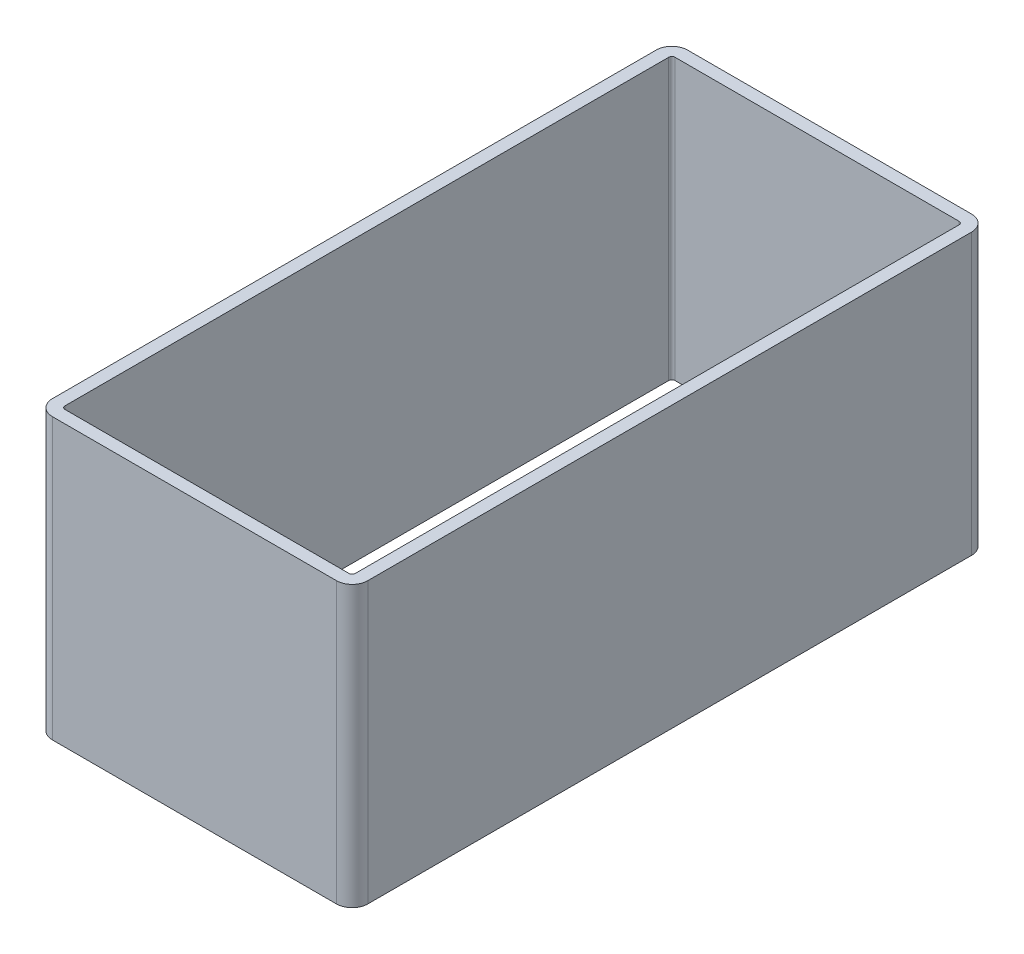
ISO-10303-21;
HEADER;
FILE_DESCRIPTION(('STEP AP214'),'2;1');
FILE_NAME('part.step','',(''),(''),'','','');
FILE_SCHEMA(('AUTOMOTIVE_DESIGN { 1 0 10303 214 1 1 1 1 }'));
ENDSEC;
DATA;
#1=APPLICATION_CONTEXT('core data for automotive mechanical design processes');
#2=APPLICATION_PROTOCOL_DEFINITION('international standard','automotive_design',2000,#1);
#3=PRODUCT_CONTEXT('',#1,'mechanical');
#4=PRODUCT('Part','Part','',(#3));
#5=PRODUCT_RELATED_PRODUCT_CATEGORY('part','',(#4));
#6=PRODUCT_DEFINITION_FORMATION('','',#4);
#7=PRODUCT_DEFINITION_CONTEXT('part definition',#1,'design');
#8=PRODUCT_DEFINITION('design','',#6,#7);
#9=PRODUCT_DEFINITION_SHAPE('','',#8);
#10=(LENGTH_UNIT() NAMED_UNIT(*) SI_UNIT(.MILLI.,.METRE.));
#11=(NAMED_UNIT(*) PLANE_ANGLE_UNIT() SI_UNIT($,.RADIAN.));
#12=(NAMED_UNIT(*) SI_UNIT($,.STERADIAN.) SOLID_ANGLE_UNIT());
#13=UNCERTAINTY_MEASURE_WITH_UNIT(LENGTH_MEASURE(1.E-05),#10,'distance_accuracy_value','');
#14=(GEOMETRIC_REPRESENTATION_CONTEXT(3) GLOBAL_UNCERTAINTY_ASSIGNED_CONTEXT((#13)) GLOBAL_UNIT_ASSIGNED_CONTEXT((#10,
#11,#12)) REPRESENTATION_CONTEXT('',''));
#15=CARTESIAN_POINT('',(0.,0.,0.));
#16=DIRECTION('',(0.,0.,1.));
#17=DIRECTION('',(1.,0.,0.));
#18=AXIS2_PLACEMENT_3D('',#15,#16,#17);
#19=CARTESIAN_POINT('',(10.08,8.95,-20.3));
#20=DIRECTION('',(-1.,0.,0.));
#21=DIRECTION('',(0.,0.,1.));
#22=AXIS2_PLACEMENT_3D('',#19,#20,#21);
#23=PLANE('',#22);
#24=DIRECTION('',(0.,0.,-1.));
#25=VECTOR('',#24,1.);
#26=CARTESIAN_POINT('',(10.08,-8.95,-20.3));
#27=LINE('',#26,#25);
#28=CARTESIAN_POINT('',(10.08,-8.95,19.3));
#29=VERTEX_POINT('',#28);
#30=CARTESIAN_POINT('',(10.08,-8.95,-19.3));
#31=VERTEX_POINT('',#30);
#32=EDGE_CURVE('E205',#29,#31,#27,.T.);
#33=ORIENTED_EDGE('',*,*,#32,.T.);
#34=DIRECTION('',(0.,-1.,0.));
#35=VECTOR('',#34,1.);
#36=CARTESIAN_POINT('',(10.08,8.95,-19.3));
#37=LINE('',#36,#35);
#38=CARTESIAN_POINT('',(10.08,8.95,-19.3));
#39=VERTEX_POINT('',#38);
#40=EDGE_CURVE('E269',#31,#39,#37,.F.);
#41=ORIENTED_EDGE('',*,*,#40,.T.);
#42=DIRECTION('',(0.,0.,-1.));
#43=VECTOR('',#42,1.);
#44=CARTESIAN_POINT('',(10.08,8.95,-20.3));
#45=LINE('',#44,#43);
#46=CARTESIAN_POINT('',(10.08,8.95,19.3));
#47=VERTEX_POINT('',#46);
#48=EDGE_CURVE('E217',#47,#39,#45,.T.);
#49=ORIENTED_EDGE('',*,*,#48,.F.);
#50=DIRECTION('',(0.,-1.,0.));
#51=VECTOR('',#50,1.);
#52=CARTESIAN_POINT('',(10.08,8.95,19.3));
#53=LINE('',#52,#51);
#54=EDGE_CURVE('E266',#47,#29,#53,.T.);
#55=ORIENTED_EDGE('',*,*,#54,.T.);
#56=EDGE_LOOP('',(#33,#41,#49,#55));
#57=FACE_BOUND('',#56,.T.);
#58=ADVANCED_FACE('F36',(#57),#23,.F.);
#59=CARTESIAN_POINT('',(-10.08,8.95,-20.3));
#60=DIRECTION('',(0.,0.,1.));
#61=DIRECTION('',(1.,0.,0.));
#62=AXIS2_PLACEMENT_3D('',#59,#60,#61);
#63=PLANE('',#62);
#64=DIRECTION('',(-1.,0.,0.));
#65=VECTOR('',#64,1.);
#66=CARTESIAN_POINT('',(-10.08,-8.95,-20.3));
#67=LINE('',#66,#65);
#68=CARTESIAN_POINT('',(9.08,-8.95,-20.3));
#69=VERTEX_POINT('',#68);
#70=CARTESIAN_POINT('',(-9.08,-8.95,-20.3));
#71=VERTEX_POINT('',#70);
#72=EDGE_CURVE('E233',#69,#71,#67,.T.);
#73=ORIENTED_EDGE('',*,*,#72,.T.);
#74=DIRECTION('',(0.,-1.,0.));
#75=VECTOR('',#74,1.);
#76=CARTESIAN_POINT('',(-9.08,8.95,-20.3));
#77=LINE('',#76,#75);
#78=CARTESIAN_POINT('',(-9.08,8.95,-20.3));
#79=VERTEX_POINT('',#78);
#80=EDGE_CURVE('E256',#71,#79,#77,.F.);
#81=ORIENTED_EDGE('',*,*,#80,.T.);
#82=DIRECTION('',(-1.,0.,0.));
#83=VECTOR('',#82,1.);
#84=CARTESIAN_POINT('',(-10.08,8.95,-20.3));
#85=LINE('',#84,#83);
#86=CARTESIAN_POINT('',(9.08,8.95,-20.3));
#87=VERTEX_POINT('',#86);
#88=EDGE_CURVE('E220',#87,#79,#85,.T.);
#89=ORIENTED_EDGE('',*,*,#88,.F.);
#90=DIRECTION('',(0.,-1.,0.));
#91=VECTOR('',#90,1.);
#92=CARTESIAN_POINT('',(9.08,8.95,-20.3));
#93=LINE('',#92,#91);
#94=EDGE_CURVE('E253',#87,#69,#93,.T.);
#95=ORIENTED_EDGE('',*,*,#94,.T.);
#96=EDGE_LOOP('',(#73,#81,#89,#95));
#97=FACE_BOUND('',#96,.T.);
#98=ADVANCED_FACE('F297',(#97),#63,.F.);
#99=CARTESIAN_POINT('',(-10.08,8.95,-20.3));
#100=DIRECTION('',(1.,0.,0.));
#101=DIRECTION('',(0.,0.,-1.));
#102=AXIS2_PLACEMENT_3D('',#99,#100,#101);
#103=PLANE('',#102);
#104=DIRECTION('',(0.,0.,1.));
#105=VECTOR('',#104,1.);
#106=CARTESIAN_POINT('',(-10.08,8.95,-20.3));
#107=LINE('',#106,#105);
#108=CARTESIAN_POINT('',(-10.08,8.95,-19.3));
#109=VERTEX_POINT('',#108);
#110=CARTESIAN_POINT('',(-10.08,8.95,19.3));
#111=VERTEX_POINT('',#110);
#112=EDGE_CURVE('E224',#109,#111,#107,.T.);
#113=ORIENTED_EDGE('',*,*,#112,.F.);
#114=DIRECTION('',(0.,-1.,0.));
#115=VECTOR('',#114,1.);
#116=CARTESIAN_POINT('',(-10.08,8.95,-19.3));
#117=LINE('',#116,#115);
#118=CARTESIAN_POINT('',(-10.08,-8.95,-19.3));
#119=VERTEX_POINT('',#118);
#120=EDGE_CURVE('E242',#109,#119,#117,.T.);
#121=ORIENTED_EDGE('',*,*,#120,.T.);
#122=DIRECTION('',(0.,0.,1.));
#123=VECTOR('',#122,1.);
#124=CARTESIAN_POINT('',(-10.08,-8.95,-20.3));
#125=LINE('',#124,#123);
#126=CARTESIAN_POINT('',(-10.08,-8.95,19.3));
#127=VERTEX_POINT('',#126);
#128=EDGE_CURVE('E236',#119,#127,#125,.T.);
#129=ORIENTED_EDGE('',*,*,#128,.T.);
#130=DIRECTION('',(0.,-1.,0.));
#131=VECTOR('',#130,1.);
#132=CARTESIAN_POINT('',(-10.08,8.95,19.3));
#133=LINE('',#132,#131);
#134=EDGE_CURVE('E230',#127,#111,#133,.F.);
#135=ORIENTED_EDGE('',*,*,#134,.T.);
#136=EDGE_LOOP('',(#113,#121,#129,#135));
#137=FACE_BOUND('',#136,.T.);
#138=ADVANCED_FACE('F305',(#137),#103,.F.);
#139=CARTESIAN_POINT('',(-10.08,8.95,20.3));
#140=DIRECTION('',(0.,0.,-1.));
#141=DIRECTION('',(-1.,0.,0.));
#142=AXIS2_PLACEMENT_3D('',#139,#140,#141);
#143=PLANE('',#142);
#144=DIRECTION('',(1.,0.,0.));
#145=VECTOR('',#144,1.);
#146=CARTESIAN_POINT('',(-10.08,-8.95,20.3));
#147=LINE('',#146,#145);
#148=CARTESIAN_POINT('',(-9.08,-8.95,20.3));
#149=VERTEX_POINT('',#148);
#150=CARTESIAN_POINT('',(9.08,-8.95,20.3));
#151=VERTEX_POINT('',#150);
#152=EDGE_CURVE('E221',#149,#151,#147,.T.);
#153=ORIENTED_EDGE('',*,*,#152,.T.);
#154=DIRECTION('',(0.,-1.,0.));
#155=VECTOR('',#154,1.);
#156=CARTESIAN_POINT('',(9.08,8.95,20.3));
#157=LINE('',#156,#155);
#158=CARTESIAN_POINT('',(9.08,8.95,20.3));
#159=VERTEX_POINT('',#158);
#160=EDGE_CURVE('E11',#151,#159,#157,.F.);
#161=ORIENTED_EDGE('',*,*,#160,.T.);
#162=DIRECTION('',(1.,0.,0.));
#163=VECTOR('',#162,1.);
#164=CARTESIAN_POINT('',(-10.08,8.95,20.3));
#165=LINE('',#164,#163);
#166=CARTESIAN_POINT('',(-9.08,8.95,20.3));
#167=VERTEX_POINT('',#166);
#168=EDGE_CURVE('E227',#167,#159,#165,.T.);
#169=ORIENTED_EDGE('',*,*,#168,.F.);
#170=DIRECTION('',(0.,-1.,0.));
#171=VECTOR('',#170,1.);
#172=CARTESIAN_POINT('',(-9.08,8.95,20.3));
#173=LINE('',#172,#171);
#174=EDGE_CURVE('E44',#167,#149,#173,.T.);
#175=ORIENTED_EDGE('',*,*,#174,.T.);
#176=EDGE_LOOP('',(#153,#161,#169,#175));
#177=FACE_BOUND('',#176,.T.);
#178=ADVANCED_FACE('F275',(#177),#143,.F.);
#179=CARTESIAN_POINT('',(0.,8.95,0.));
#180=DIRECTION('',(0.,1.,0.));
#181=DIRECTION('',(0.,0.,1.));
#182=AXIS2_PLACEMENT_3D('',#179,#180,#181);
#183=PLANE('',#182);
#184=CARTESIAN_POINT('',(9.08,8.95,-19.3));
#185=DIRECTION('',(0.,1.,0.));
#186=DIRECTION('',(0.,0.,1.));
#187=AXIS2_PLACEMENT_3D('',#184,#185,#186);
#188=CIRCLE('',#187,0.200000000000003);
#189=CARTESIAN_POINT('',(9.28,8.95,-19.3));
#190=VERTEX_POINT('',#189);
#191=CARTESIAN_POINT('',(9.08,8.95,-19.5));
#192=VERTEX_POINT('',#191);
#193=EDGE_CURVE('E51',#190,#192,#188,.T.);
#194=ORIENTED_EDGE('',*,*,#193,.F.);
#195=DIRECTION('',(0.,0.,-1.));
#196=VECTOR('',#195,1.);
#197=CARTESIAN_POINT('',(9.28,8.95,19.3));
#198=LINE('',#197,#196);
#199=CARTESIAN_POINT('',(9.28,8.95,19.3));
#200=VERTEX_POINT('',#199);
#201=EDGE_CURVE('E167',#200,#190,#198,.T.);
#202=ORIENTED_EDGE('',*,*,#201,.F.);
#203=CARTESIAN_POINT('',(9.08,8.95,19.3));
#204=DIRECTION('',(0.,1.,0.));
#205=DIRECTION('',(0.,0.,1.));
#206=AXIS2_PLACEMENT_3D('',#203,#204,#205);
#207=CIRCLE('',#206,0.200000000000001);
#208=CARTESIAN_POINT('',(9.08,8.95,19.5));
#209=VERTEX_POINT('',#208);
#210=EDGE_CURVE('E170',#209,#200,#207,.T.);
#211=ORIENTED_EDGE('',*,*,#210,.F.);
#212=DIRECTION('',(1.,0.,0.));
#213=VECTOR('',#212,1.);
#214=CARTESIAN_POINT('',(-9.08,8.95,19.5));
#215=LINE('',#214,#213);
#216=CARTESIAN_POINT('',(-9.08,8.95,19.5));
#217=VERTEX_POINT('',#216);
#218=EDGE_CURVE('E198',#217,#209,#215,.T.);
#219=ORIENTED_EDGE('',*,*,#218,.F.);
#220=CARTESIAN_POINT('',(-9.08,8.95,19.3));
#221=DIRECTION('',(0.,1.,0.));
#222=DIRECTION('',(0.,0.,1.));
#223=AXIS2_PLACEMENT_3D('',#220,#221,#222);
#224=CIRCLE('',#223,0.200000000000001);
#225=CARTESIAN_POINT('',(-9.28,8.95,19.3));
#226=VERTEX_POINT('',#225);
#227=EDGE_CURVE('E195',#226,#217,#224,.T.);
#228=ORIENTED_EDGE('',*,*,#227,.F.);
#229=DIRECTION('',(0.,0.,1.));
#230=VECTOR('',#229,1.);
#231=CARTESIAN_POINT('',(-9.28,8.95,-19.3));
#232=LINE('',#231,#230);
#233=CARTESIAN_POINT('',(-9.28,8.95,-19.3));
#234=VERTEX_POINT('',#233);
#235=EDGE_CURVE('E192',#234,#226,#232,.T.);
#236=ORIENTED_EDGE('',*,*,#235,.F.);
#237=CARTESIAN_POINT('',(-9.08,8.95,-19.3));
#238=DIRECTION('',(0.,1.,0.));
#239=DIRECTION('',(0.,0.,1.));
#240=AXIS2_PLACEMENT_3D('',#237,#238,#239);
#241=CIRCLE('',#240,0.2);
#242=CARTESIAN_POINT('',(-9.08,8.95,-19.5));
#243=VERTEX_POINT('',#242);
#244=EDGE_CURVE('E189',#243,#234,#241,.T.);
#245=ORIENTED_EDGE('',*,*,#244,.F.);
#246=DIRECTION('',(-1.,0.,0.));
#247=VECTOR('',#246,1.);
#248=CARTESIAN_POINT('',(9.08,8.95,-19.5));
#249=LINE('',#248,#247);
#250=EDGE_CURVE('E187',#192,#243,#249,.T.);
#251=ORIENTED_EDGE('',*,*,#250,.F.);
#252=EDGE_LOOP('',(#194,#202,#211,#219,#228,#236,#245,#251));
#253=FACE_BOUND('',#252,.T.);
#254=ORIENTED_EDGE('',*,*,#88,.T.);
#255=CARTESIAN_POINT('',(-9.08,8.95,-19.3));
#256=DIRECTION('',(0.,1.,0.));
#257=DIRECTION('',(0.,0.,1.));
#258=AXIS2_PLACEMENT_3D('',#255,#256,#257);
#259=CIRCLE('',#258,1.);
#260=EDGE_CURVE('E264',#79,#109,#259,.T.);
#261=ORIENTED_EDGE('',*,*,#260,.T.);
#262=ORIENTED_EDGE('',*,*,#112,.T.);
#263=CARTESIAN_POINT('',(-9.08,8.95,19.3));
#264=DIRECTION('',(0.,1.,0.));
#265=DIRECTION('',(0.,0.,1.));
#266=AXIS2_PLACEMENT_3D('',#263,#264,#265);
#267=CIRCLE('',#266,1.);
#268=EDGE_CURVE('E258',#111,#167,#267,.T.);
#269=ORIENTED_EDGE('',*,*,#268,.T.);
#270=ORIENTED_EDGE('',*,*,#168,.T.);
#271=CARTESIAN_POINT('',(9.08,8.95,19.3));
#272=DIRECTION('',(0.,1.,0.));
#273=DIRECTION('',(0.,0.,1.));
#274=AXIS2_PLACEMENT_3D('',#271,#272,#273);
#275=CIRCLE('',#274,1.);
#276=EDGE_CURVE('E260',#159,#47,#275,.T.);
#277=ORIENTED_EDGE('',*,*,#276,.T.);
#278=ORIENTED_EDGE('',*,*,#48,.T.);
#279=CARTESIAN_POINT('',(9.08,8.95,-19.3));
#280=DIRECTION('',(0.,1.,0.));
#281=DIRECTION('',(0.,0.,1.));
#282=AXIS2_PLACEMENT_3D('',#279,#280,#281);
#283=CIRCLE('',#282,1.);
#284=EDGE_CURVE('E262',#39,#87,#283,.T.);
#285=ORIENTED_EDGE('',*,*,#284,.T.);
#286=EDGE_LOOP('',(#254,#261,#262,#269,#270,#277,#278,#285));
#287=FACE_BOUND('',#286,.T.);
#288=ADVANCED_FACE('F290',(#253,#287),#183,.T.);
#289=CARTESIAN_POINT('',(0.,-8.95,0.));
#290=DIRECTION('',(0.,1.,0.));
#291=DIRECTION('',(0.,0.,1.));
#292=AXIS2_PLACEMENT_3D('',#289,#290,#291);
#293=PLANE('',#292);
#294=DIRECTION('',(0.,0.,-1.));
#295=VECTOR('',#294,1.);
#296=CARTESIAN_POINT('',(9.28,-8.95,19.3));
#297=LINE('',#296,#295);
#298=CARTESIAN_POINT('',(9.28,-8.95,19.3));
#299=VERTEX_POINT('',#298);
#300=CARTESIAN_POINT('',(9.28,-8.95,-19.3));
#301=VERTEX_POINT('',#300);
#302=EDGE_CURVE('E156',#299,#301,#297,.T.);
#303=ORIENTED_EDGE('',*,*,#302,.T.);
#304=CARTESIAN_POINT('',(9.08,-8.95,-19.3));
#305=DIRECTION('',(0.,1.,0.));
#306=DIRECTION('',(0.,0.,1.));
#307=AXIS2_PLACEMENT_3D('',#304,#305,#306);
#308=CIRCLE('',#307,0.200000000000003);
#309=CARTESIAN_POINT('',(9.08,-8.95,-19.5));
#310=VERTEX_POINT('',#309);
#311=EDGE_CURVE('E150',#301,#310,#308,.T.);
#312=ORIENTED_EDGE('',*,*,#311,.T.);
#313=DIRECTION('',(-1.,0.,0.));
#314=VECTOR('',#313,1.);
#315=CARTESIAN_POINT('',(9.08,-8.95,-19.5));
#316=LINE('',#315,#314);
#317=CARTESIAN_POINT('',(-9.08,-8.95,-19.5));
#318=VERTEX_POINT('',#317);
#319=EDGE_CURVE('E159',#310,#318,#316,.T.);
#320=ORIENTED_EDGE('',*,*,#319,.T.);
#321=CARTESIAN_POINT('',(-9.08,-8.95,-19.3));
#322=DIRECTION('',(0.,1.,0.));
#323=DIRECTION('',(0.,0.,1.));
#324=AXIS2_PLACEMENT_3D('',#321,#322,#323);
#325=CIRCLE('',#324,0.2);
#326=CARTESIAN_POINT('',(-9.28,-8.95,-19.3));
#327=VERTEX_POINT('',#326);
#328=EDGE_CURVE('E59',#318,#327,#325,.T.);
#329=ORIENTED_EDGE('',*,*,#328,.T.);
#330=DIRECTION('',(0.,0.,1.));
#331=VECTOR('',#330,1.);
#332=CARTESIAN_POINT('',(-9.28,-8.95,-19.3));
#333=LINE('',#332,#331);
#334=CARTESIAN_POINT('',(-9.28,-8.95,19.3));
#335=VERTEX_POINT('',#334);
#336=EDGE_CURVE('E174',#327,#335,#333,.T.);
#337=ORIENTED_EDGE('',*,*,#336,.T.);
#338=CARTESIAN_POINT('',(-9.08,-8.95,19.3));
#339=DIRECTION('',(0.,1.,0.));
#340=DIRECTION('',(0.,0.,1.));
#341=AXIS2_PLACEMENT_3D('',#338,#339,#340);
#342=CIRCLE('',#341,0.200000000000001);
#343=CARTESIAN_POINT('',(-9.08,-8.95,19.5));
#344=VERTEX_POINT('',#343);
#345=EDGE_CURVE('E177',#335,#344,#342,.T.);
#346=ORIENTED_EDGE('',*,*,#345,.T.);
#347=DIRECTION('',(1.,0.,0.));
#348=VECTOR('',#347,1.);
#349=CARTESIAN_POINT('',(-9.08,-8.95,19.5));
#350=LINE('',#349,#348);
#351=CARTESIAN_POINT('',(9.08,-8.95,19.5));
#352=VERTEX_POINT('',#351);
#353=EDGE_CURVE('E180',#344,#352,#350,.T.);
#354=ORIENTED_EDGE('',*,*,#353,.T.);
#355=CARTESIAN_POINT('',(9.08,-8.95,19.3));
#356=DIRECTION('',(0.,1.,0.));
#357=DIRECTION('',(0.,0.,1.));
#358=AXIS2_PLACEMENT_3D('',#355,#356,#357);
#359=CIRCLE('',#358,0.200000000000001);
#360=EDGE_CURVE('E183',#352,#299,#359,.T.);
#361=ORIENTED_EDGE('',*,*,#360,.T.);
#362=EDGE_LOOP('',(#303,#312,#320,#329,#337,#346,#354,#361));
#363=FACE_BOUND('',#362,.T.);
#364=ORIENTED_EDGE('',*,*,#128,.F.);
#365=CARTESIAN_POINT('',(-9.08,-8.95,-19.3));
#366=DIRECTION('',(0.,1.,0.));
#367=DIRECTION('',(0.,0.,1.));
#368=AXIS2_PLACEMENT_3D('',#365,#366,#367);
#369=CIRCLE('',#368,1.);
#370=EDGE_CURVE('E251',#119,#71,#369,.F.);
#371=ORIENTED_EDGE('',*,*,#370,.T.);
#372=ORIENTED_EDGE('',*,*,#72,.F.);
#373=CARTESIAN_POINT('',(9.08,-8.95,-19.3));
#374=DIRECTION('',(0.,1.,0.));
#375=DIRECTION('',(0.,0.,1.));
#376=AXIS2_PLACEMENT_3D('',#373,#374,#375);
#377=CIRCLE('',#376,1.);
#378=EDGE_CURVE('E249',#69,#31,#377,.F.);
#379=ORIENTED_EDGE('',*,*,#378,.T.);
#380=ORIENTED_EDGE('',*,*,#32,.F.);
#381=CARTESIAN_POINT('',(9.08,-8.95,19.3));
#382=DIRECTION('',(0.,1.,0.));
#383=DIRECTION('',(0.,0.,1.));
#384=AXIS2_PLACEMENT_3D('',#381,#382,#383);
#385=CIRCLE('',#384,1.);
#386=EDGE_CURVE('E247',#29,#151,#385,.F.);
#387=ORIENTED_EDGE('',*,*,#386,.T.);
#388=ORIENTED_EDGE('',*,*,#152,.F.);
#389=CARTESIAN_POINT('',(-9.08,-8.95,19.3));
#390=DIRECTION('',(0.,1.,0.));
#391=DIRECTION('',(0.,0.,1.));
#392=AXIS2_PLACEMENT_3D('',#389,#390,#391);
#393=CIRCLE('',#392,1.);
#394=EDGE_CURVE('E245',#149,#127,#393,.F.);
#395=ORIENTED_EDGE('',*,*,#394,.T.);
#396=EDGE_LOOP('',(#364,#371,#372,#379,#380,#387,#388,#395));
#397=FACE_BOUND('',#396,.T.);
#398=ADVANCED_FACE('F163',(#363,#397),#293,.F.);
#399=CARTESIAN_POINT('',(-9.08,8.95,-19.3));
#400=DIRECTION('',(0.,-1.,0.));
#401=DIRECTION('',(0.,0.,-1.));
#402=AXIS2_PLACEMENT_3D('',#399,#400,#401);
#403=CYLINDRICAL_SURFACE('',#402,1.);
#404=ORIENTED_EDGE('',*,*,#260,.F.);
#405=ORIENTED_EDGE('',*,*,#80,.F.);
#406=ORIENTED_EDGE('',*,*,#370,.F.);
#407=ORIENTED_EDGE('',*,*,#120,.F.);
#408=EDGE_LOOP('',(#404,#405,#406,#407));
#409=FACE_BOUND('',#408,.T.);
#410=ADVANCED_FACE('F302',(#409),#403,.T.);
#411=CARTESIAN_POINT('',(9.08,8.95,-19.3));
#412=DIRECTION('',(0.,-1.,0.));
#413=DIRECTION('',(0.,0.,-1.));
#414=AXIS2_PLACEMENT_3D('',#411,#412,#413);
#415=CYLINDRICAL_SURFACE('',#414,1.);
#416=ORIENTED_EDGE('',*,*,#284,.F.);
#417=ORIENTED_EDGE('',*,*,#40,.F.);
#418=ORIENTED_EDGE('',*,*,#378,.F.);
#419=ORIENTED_EDGE('',*,*,#94,.F.);
#420=EDGE_LOOP('',(#416,#417,#418,#419));
#421=FACE_BOUND('',#420,.T.);
#422=ADVANCED_FACE('F294',(#421),#415,.T.);
#423=CARTESIAN_POINT('',(9.08,8.95,19.3));
#424=DIRECTION('',(0.,-1.,0.));
#425=DIRECTION('',(0.,0.,-1.));
#426=AXIS2_PLACEMENT_3D('',#423,#424,#425);
#427=CYLINDRICAL_SURFACE('',#426,1.);
#428=ORIENTED_EDGE('',*,*,#276,.F.);
#429=ORIENTED_EDGE('',*,*,#160,.F.);
#430=ORIENTED_EDGE('',*,*,#386,.F.);
#431=ORIENTED_EDGE('',*,*,#54,.F.);
#432=EDGE_LOOP('',(#428,#429,#430,#431));
#433=FACE_BOUND('',#432,.T.);
#434=ADVANCED_FACE('F284',(#433),#427,.T.);
#435=CARTESIAN_POINT('',(-9.08,8.95,19.3));
#436=DIRECTION('',(0.,-1.,0.));
#437=DIRECTION('',(0.,0.,-1.));
#438=AXIS2_PLACEMENT_3D('',#435,#436,#437);
#439=CYLINDRICAL_SURFACE('',#438,1.);
#440=ORIENTED_EDGE('',*,*,#268,.F.);
#441=ORIENTED_EDGE('',*,*,#134,.F.);
#442=ORIENTED_EDGE('',*,*,#394,.F.);
#443=ORIENTED_EDGE('',*,*,#174,.F.);
#444=EDGE_LOOP('',(#440,#441,#442,#443));
#445=FACE_BOUND('',#444,.T.);
#446=ADVANCED_FACE('F38',(#445),#439,.T.);
#447=CARTESIAN_POINT('',(9.08,-8.95,-19.3));
#448=DIRECTION('',(0.,1.,0.));
#449=DIRECTION('',(0.,0.,1.));
#450=AXIS2_PLACEMENT_3D('',#447,#448,#449);
#451=CYLINDRICAL_SURFACE('',#450,0.200000000000003);
#452=ORIENTED_EDGE('',*,*,#193,.T.);
#453=DIRECTION('',(0.,1.,0.));
#454=VECTOR('',#453,1.);
#455=CARTESIAN_POINT('',(9.08,-8.95,-19.5));
#456=LINE('',#455,#454);
#457=EDGE_CURVE('E146',#310,#192,#456,.T.);
#458=ORIENTED_EDGE('',*,*,#457,.F.);
#459=ORIENTED_EDGE('',*,*,#311,.F.);
#460=DIRECTION('',(0.,1.,0.));
#461=VECTOR('',#460,1.);
#462=CARTESIAN_POINT('',(9.28,-8.95,-19.3));
#463=LINE('',#462,#461);
#464=EDGE_CURVE('E203',#301,#190,#463,.T.);
#465=ORIENTED_EDGE('',*,*,#464,.T.);
#466=EDGE_LOOP('',(#452,#458,#459,#465));
#467=FACE_BOUND('',#466,.T.);
#468=ADVANCED_FACE('F148',(#467),#451,.F.);
#469=CARTESIAN_POINT('',(9.28,-8.95,19.3));
#470=DIRECTION('',(1.,0.,0.));
#471=DIRECTION('',(0.,0.,-1.));
#472=AXIS2_PLACEMENT_3D('',#469,#470,#471);
#473=PLANE('',#472);
#474=ORIENTED_EDGE('',*,*,#201,.T.);
#475=ORIENTED_EDGE('',*,*,#464,.F.);
#476=ORIENTED_EDGE('',*,*,#302,.F.);
#477=DIRECTION('',(0.,1.,0.));
#478=VECTOR('',#477,1.);
#479=CARTESIAN_POINT('',(9.28,-8.95,19.3));
#480=LINE('',#479,#478);
#481=EDGE_CURVE('E206',#299,#200,#480,.T.);
#482=ORIENTED_EDGE('',*,*,#481,.T.);
#483=EDGE_LOOP('',(#474,#475,#476,#482));
#484=FACE_BOUND('',#483,.T.);
#485=ADVANCED_FACE('F312',(#484),#473,.F.);
#486=CARTESIAN_POINT('',(9.08,-8.95,19.3));
#487=DIRECTION('',(0.,1.,0.));
#488=DIRECTION('',(0.,0.,1.));
#489=AXIS2_PLACEMENT_3D('',#486,#487,#488);
#490=CYLINDRICAL_SURFACE('',#489,0.200000000000001);
#491=ORIENTED_EDGE('',*,*,#210,.T.);
#492=ORIENTED_EDGE('',*,*,#481,.F.);
#493=ORIENTED_EDGE('',*,*,#360,.F.);
#494=DIRECTION('',(0.,1.,0.));
#495=VECTOR('',#494,1.);
#496=CARTESIAN_POINT('',(9.08,-8.95,19.5));
#497=LINE('',#496,#495);
#498=EDGE_CURVE('E208',#352,#209,#497,.T.);
#499=ORIENTED_EDGE('',*,*,#498,.T.);
#500=EDGE_LOOP('',(#491,#492,#493,#499));
#501=FACE_BOUND('',#500,.T.);
#502=ADVANCED_FACE('F372',(#501),#490,.F.);
#503=CARTESIAN_POINT('',(-9.08,-8.95,19.5));
#504=DIRECTION('',(0.,0.,1.));
#505=DIRECTION('',(1.,0.,0.));
#506=AXIS2_PLACEMENT_3D('',#503,#504,#505);
#507=PLANE('',#506);
#508=ORIENTED_EDGE('',*,*,#218,.T.);
#509=ORIENTED_EDGE('',*,*,#498,.F.);
#510=ORIENTED_EDGE('',*,*,#353,.F.);
#511=DIRECTION('',(0.,1.,0.));
#512=VECTOR('',#511,1.);
#513=CARTESIAN_POINT('',(-9.08,-8.95,19.5));
#514=LINE('',#513,#512);
#515=EDGE_CURVE('E210',#344,#217,#514,.T.);
#516=ORIENTED_EDGE('',*,*,#515,.T.);
#517=EDGE_LOOP('',(#508,#509,#510,#516));
#518=FACE_BOUND('',#517,.T.);
#519=ADVANCED_FACE('F382',(#518),#507,.F.);
#520=CARTESIAN_POINT('',(-9.08,-8.95,19.3));
#521=DIRECTION('',(0.,1.,0.));
#522=DIRECTION('',(0.,0.,1.));
#523=AXIS2_PLACEMENT_3D('',#520,#521,#522);
#524=CYLINDRICAL_SURFACE('',#523,0.200000000000001);
#525=ORIENTED_EDGE('',*,*,#227,.T.);
#526=ORIENTED_EDGE('',*,*,#515,.F.);
#527=ORIENTED_EDGE('',*,*,#345,.F.);
#528=DIRECTION('',(0.,1.,0.));
#529=VECTOR('',#528,1.);
#530=CARTESIAN_POINT('',(-9.28,-8.95,19.3));
#531=LINE('',#530,#529);
#532=EDGE_CURVE('E212',#335,#226,#531,.T.);
#533=ORIENTED_EDGE('',*,*,#532,.T.);
#534=EDGE_LOOP('',(#525,#526,#527,#533));
#535=FACE_BOUND('',#534,.T.);
#536=ADVANCED_FACE('F392',(#535),#524,.F.);
#537=CARTESIAN_POINT('',(-9.28,-8.95,-19.3));
#538=DIRECTION('',(-1.,0.,0.));
#539=DIRECTION('',(0.,0.,1.));
#540=AXIS2_PLACEMENT_3D('',#537,#538,#539);
#541=PLANE('',#540);
#542=ORIENTED_EDGE('',*,*,#235,.T.);
#543=ORIENTED_EDGE('',*,*,#532,.F.);
#544=ORIENTED_EDGE('',*,*,#336,.F.);
#545=DIRECTION('',(0.,1.,0.));
#546=VECTOR('',#545,1.);
#547=CARTESIAN_POINT('',(-9.28,-8.95,-19.3));
#548=LINE('',#547,#546);
#549=EDGE_CURVE('E214',#327,#234,#548,.T.);
#550=ORIENTED_EDGE('',*,*,#549,.T.);
#551=EDGE_LOOP('',(#542,#543,#544,#550));
#552=FACE_BOUND('',#551,.T.);
#553=ADVANCED_FACE('F402',(#552),#541,.F.);
#554=CARTESIAN_POINT('',(-9.08,-8.95,-19.3));
#555=DIRECTION('',(0.,1.,0.));
#556=DIRECTION('',(0.,0.,1.));
#557=AXIS2_PLACEMENT_3D('',#554,#555,#556);
#558=CYLINDRICAL_SURFACE('',#557,0.2);
#559=ORIENTED_EDGE('',*,*,#244,.T.);
#560=ORIENTED_EDGE('',*,*,#549,.F.);
#561=ORIENTED_EDGE('',*,*,#328,.F.);
#562=DIRECTION('',(0.,1.,0.));
#563=VECTOR('',#562,1.);
#564=CARTESIAN_POINT('',(-9.08,-8.95,-19.5));
#565=LINE('',#564,#563);
#566=EDGE_CURVE('E155',#318,#243,#565,.T.);
#567=ORIENTED_EDGE('',*,*,#566,.T.);
#568=EDGE_LOOP('',(#559,#560,#561,#567));
#569=FACE_BOUND('',#568,.T.);
#570=ADVANCED_FACE('F412',(#569),#558,.F.);
#571=CARTESIAN_POINT('',(9.08,-8.95,-19.5));
#572=DIRECTION('',(0.,0.,-1.));
#573=DIRECTION('',(-1.,0.,0.));
#574=AXIS2_PLACEMENT_3D('',#571,#572,#573);
#575=PLANE('',#574);
#576=ORIENTED_EDGE('',*,*,#250,.T.);
#577=ORIENTED_EDGE('',*,*,#566,.F.);
#578=ORIENTED_EDGE('',*,*,#319,.F.);
#579=ORIENTED_EDGE('',*,*,#457,.T.);
#580=EDGE_LOOP('',(#576,#577,#578,#579));
#581=FACE_BOUND('',#580,.T.);
#582=ADVANCED_FACE('F160',(#581),#575,.F.);
#583=CLOSED_SHELL('',(#58,#98,#138,#178,#288,#398,#410,#422,#434,#446,#468,#485,#502,#519,#536,
#553,#570,#582));
#584=MANIFOLD_SOLID_BREP('B2',#583);
#585=ADVANCED_BREP_SHAPE_REPRESENTATION('',(#18,#584),#14);
#586=SHAPE_DEFINITION_REPRESENTATION(#9,#585);
ENDSEC;
END-ISO-10303-21;
